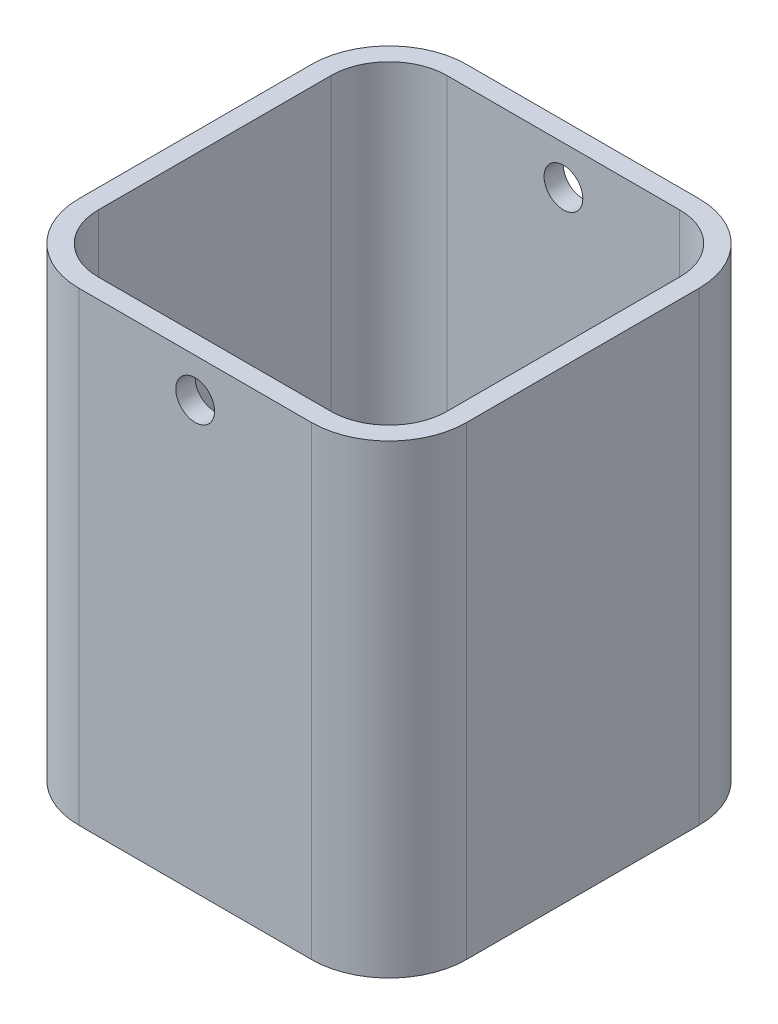
ISO-10303-21;
HEADER;
FILE_DESCRIPTION(('STEP AP214'),'2;1');
FILE_NAME('part.step','',(''),(''),'','','');
FILE_SCHEMA(('AUTOMOTIVE_DESIGN { 1 0 10303 214 1 1 1 1 }'));
ENDSEC;
DATA;
#1=APPLICATION_CONTEXT('core data for automotive mechanical design processes');
#2=APPLICATION_PROTOCOL_DEFINITION('international standard','automotive_design',2000,#1);
#3=PRODUCT_CONTEXT('',#1,'mechanical');
#4=PRODUCT('Part','Part','',(#3));
#5=PRODUCT_RELATED_PRODUCT_CATEGORY('part','',(#4));
#6=PRODUCT_DEFINITION_FORMATION('','',#4);
#7=PRODUCT_DEFINITION_CONTEXT('part definition',#1,'design');
#8=PRODUCT_DEFINITION('design','',#6,#7);
#9=PRODUCT_DEFINITION_SHAPE('','',#8);
#10=(LENGTH_UNIT() NAMED_UNIT(*) SI_UNIT(.MILLI.,.METRE.));
#11=(NAMED_UNIT(*) PLANE_ANGLE_UNIT() SI_UNIT($,.RADIAN.));
#12=(NAMED_UNIT(*) SI_UNIT($,.STERADIAN.) SOLID_ANGLE_UNIT());
#13=UNCERTAINTY_MEASURE_WITH_UNIT(LENGTH_MEASURE(1.E-05),#10,'distance_accuracy_value','');
#14=(GEOMETRIC_REPRESENTATION_CONTEXT(3) GLOBAL_UNCERTAINTY_ASSIGNED_CONTEXT((#13)) GLOBAL_UNIT_ASSIGNED_CONTEXT((#10,
#11,#12)) REPRESENTATION_CONTEXT('',''));
#15=CARTESIAN_POINT('',(0.,0.,0.));
#16=DIRECTION('',(0.,0.,1.));
#17=DIRECTION('',(1.,0.,0.));
#18=AXIS2_PLACEMENT_3D('',#15,#16,#17);
#19=CARTESIAN_POINT('',(0.,60.,0.));
#20=DIRECTION('',(1.,0.,0.));
#21=DIRECTION('',(0.,0.,-1.));
#22=AXIS2_PLACEMENT_3D('',#19,#20,#21);
#23=PLANE('',#22);
#24=DIRECTION('',(0.,0.,1.));
#25=VECTOR('',#24,1.);
#26=CARTESIAN_POINT('',(0.,60.,0.));
#27=LINE('',#26,#25);
#28=CARTESIAN_POINT('',(0.,60.,-40.));
#29=VERTEX_POINT('',#28);
#30=CARTESIAN_POINT('',(0.,60.,-10.));
#31=VERTEX_POINT('',#30);
#32=EDGE_CURVE('E223',#29,#31,#27,.T.);
#33=ORIENTED_EDGE('',*,*,#32,.F.);
#34=DIRECTION('',(0.,-1.,0.));
#35=VECTOR('',#34,1.);
#36=CARTESIAN_POINT('',(0.,60.,-40.));
#37=LINE('',#36,#35);
#38=CARTESIAN_POINT('',(0.,0.,-40.));
#39=VERTEX_POINT('',#38);
#40=EDGE_CURVE('E257',#29,#39,#37,.T.);
#41=ORIENTED_EDGE('',*,*,#40,.T.);
#42=DIRECTION('',(0.,0.,1.));
#43=VECTOR('',#42,1.);
#44=CARTESIAN_POINT('',(0.,0.,0.));
#45=LINE('',#44,#43);
#46=CARTESIAN_POINT('',(0.,0.,-10.));
#47=VERTEX_POINT('',#46);
#48=EDGE_CURVE('E240',#39,#47,#45,.T.);
#49=ORIENTED_EDGE('',*,*,#48,.T.);
#50=DIRECTION('',(0.,-1.,0.));
#51=VECTOR('',#50,1.);
#52=CARTESIAN_POINT('',(0.,60.,-10.));
#53=LINE('',#52,#51);
#54=EDGE_CURVE('E239',#47,#31,#53,.F.);
#55=ORIENTED_EDGE('',*,*,#54,.T.);
#56=EDGE_LOOP('',(#33,#41,#49,#55));
#57=FACE_BOUND('',#56,.T.);
#58=ADVANCED_FACE('F45',(#57),#23,.F.);
#59=CARTESIAN_POINT('',(0.,60.,0.));
#60=DIRECTION('',(0.,0.,-1.));
#61=DIRECTION('',(-1.,0.,0.));
#62=AXIS2_PLACEMENT_3D('',#59,#60,#61);
#63=PLANE('',#62);
#64=CARTESIAN_POINT('',(25.,55.,0.));
#65=DIRECTION('',(0.,0.,1.));
#66=DIRECTION('',(1.,0.,0.));
#67=AXIS2_PLACEMENT_3D('',#64,#65,#66);
#68=CIRCLE('',#67,2.5);
#69=CARTESIAN_POINT('',(27.5,55.,0.));
#70=VERTEX_POINT('',#69);
#71=EDGE_CURVE('E526',#70,#70,#68,.T.);
#72=ORIENTED_EDGE('',*,*,#71,.F.);
#73=EDGE_LOOP('',(#72));
#74=FACE_BOUND('',#73,.T.);
#75=DIRECTION('',(1.,0.,0.));
#76=VECTOR('',#75,1.);
#77=CARTESIAN_POINT('',(0.,0.,0.));
#78=LINE('',#77,#76);
#79=CARTESIAN_POINT('',(10.,0.,0.));
#80=VERTEX_POINT('',#79);
#81=CARTESIAN_POINT('',(40.,0.,0.));
#82=VERTEX_POINT('',#81);
#83=EDGE_CURVE('E244',#80,#82,#78,.T.);
#84=ORIENTED_EDGE('',*,*,#83,.T.);
#85=DIRECTION('',(0.,-1.,0.));
#86=VECTOR('',#85,1.);
#87=CARTESIAN_POINT('',(40.,60.,0.));
#88=LINE('',#87,#86);
#89=CARTESIAN_POINT('',(40.,60.,0.));
#90=VERTEX_POINT('',#89);
#91=EDGE_CURVE('E11',#82,#90,#88,.F.);
#92=ORIENTED_EDGE('',*,*,#91,.T.);
#93=DIRECTION('',(1.,0.,0.));
#94=VECTOR('',#93,1.);
#95=CARTESIAN_POINT('',(0.,60.,0.));
#96=LINE('',#95,#94);
#97=CARTESIAN_POINT('',(10.,60.,0.));
#98=VERTEX_POINT('',#97);
#99=EDGE_CURVE('E227',#98,#90,#96,.T.);
#100=ORIENTED_EDGE('',*,*,#99,.F.);
#101=DIRECTION('',(0.,-1.,0.));
#102=VECTOR('',#101,1.);
#103=CARTESIAN_POINT('',(10.,60.,0.));
#104=LINE('',#103,#102);
#105=EDGE_CURVE('E55',#98,#80,#104,.T.);
#106=ORIENTED_EDGE('',*,*,#105,.T.);
#107=EDGE_LOOP('',(#84,#92,#100,#106));
#108=FACE_BOUND('',#107,.T.);
#109=ADVANCED_FACE('F304',(#74,#108),#63,.F.);
#110=CARTESIAN_POINT('',(50.,60.,0.));
#111=DIRECTION('',(-1.,0.,0.));
#112=DIRECTION('',(0.,0.,1.));
#113=AXIS2_PLACEMENT_3D('',#110,#111,#112);
#114=PLANE('',#113);
#115=DIRECTION('',(0.,0.,-1.));
#116=VECTOR('',#115,1.);
#117=CARTESIAN_POINT('',(50.,0.,0.));
#118=LINE('',#117,#116);
#119=CARTESIAN_POINT('',(50.,0.,-10.));
#120=VERTEX_POINT('',#119);
#121=CARTESIAN_POINT('',(50.,0.,-40.));
#122=VERTEX_POINT('',#121);
#123=EDGE_CURVE('E249',#120,#122,#118,.T.);
#124=ORIENTED_EDGE('',*,*,#123,.T.);
#125=DIRECTION('',(0.,-1.,0.));
#126=VECTOR('',#125,1.);
#127=CARTESIAN_POINT('',(50.,60.,-40.));
#128=LINE('',#127,#126);
#129=CARTESIAN_POINT('',(50.,60.,-40.));
#130=VERTEX_POINT('',#129);
#131=EDGE_CURVE('E70',#122,#130,#128,.F.);
#132=ORIENTED_EDGE('',*,*,#131,.T.);
#133=DIRECTION('',(0.,0.,-1.));
#134=VECTOR('',#133,1.);
#135=CARTESIAN_POINT('',(50.,60.,0.));
#136=LINE('',#135,#134);
#137=CARTESIAN_POINT('',(50.,60.,-10.));
#138=VERTEX_POINT('',#137);
#139=EDGE_CURVE('E232',#138,#130,#136,.T.);
#140=ORIENTED_EDGE('',*,*,#139,.F.);
#141=DIRECTION('',(0.,-1.,0.));
#142=VECTOR('',#141,1.);
#143=CARTESIAN_POINT('',(50.,60.,-10.));
#144=LINE('',#143,#142);
#145=EDGE_CURVE('E292',#138,#120,#144,.T.);
#146=ORIENTED_EDGE('',*,*,#145,.T.);
#147=EDGE_LOOP('',(#124,#132,#140,#146));
#148=FACE_BOUND('',#147,.T.);
#149=ADVANCED_FACE('F316',(#148),#114,.F.);
#150=CARTESIAN_POINT('',(0.,60.,-50.));
#151=DIRECTION('',(0.,0.,1.));
#152=DIRECTION('',(1.,0.,0.));
#153=AXIS2_PLACEMENT_3D('',#150,#151,#152);
#154=PLANE('',#153);
#155=CARTESIAN_POINT('',(25.,55.,-50.));
#156=DIRECTION('',(0.,0.,1.));
#157=DIRECTION('',(1.,0.,0.));
#158=AXIS2_PLACEMENT_3D('',#155,#156,#157);
#159=CIRCLE('',#158,2.5);
#160=CARTESIAN_POINT('',(27.5,55.,-50.));
#161=VERTEX_POINT('',#160);
#162=EDGE_CURVE('E523',#161,#161,#159,.T.);
#163=ORIENTED_EDGE('',*,*,#162,.T.);
#164=EDGE_LOOP('',(#163));
#165=FACE_BOUND('',#164,.T.);
#166=DIRECTION('',(-1.,0.,0.));
#167=VECTOR('',#166,1.);
#168=CARTESIAN_POINT('',(0.,0.,-50.));
#169=LINE('',#168,#167);
#170=CARTESIAN_POINT('',(40.,0.,-50.));
#171=VERTEX_POINT('',#170);
#172=CARTESIAN_POINT('',(10.,0.,-50.));
#173=VERTEX_POINT('',#172);
#174=EDGE_CURVE('E228',#171,#173,#169,.T.);
#175=ORIENTED_EDGE('',*,*,#174,.T.);
#176=DIRECTION('',(0.,-1.,0.));
#177=VECTOR('',#176,1.);
#178=CARTESIAN_POINT('',(10.,60.,-50.));
#179=LINE('',#178,#177);
#180=CARTESIAN_POINT('',(10.,60.,-50.));
#181=VERTEX_POINT('',#180);
#182=EDGE_CURVE('E277',#173,#181,#179,.F.);
#183=ORIENTED_EDGE('',*,*,#182,.T.);
#184=DIRECTION('',(-1.,0.,0.));
#185=VECTOR('',#184,1.);
#186=CARTESIAN_POINT('',(0.,60.,-50.));
#187=LINE('',#186,#185);
#188=CARTESIAN_POINT('',(40.,60.,-50.));
#189=VERTEX_POINT('',#188);
#190=EDGE_CURVE('E235',#189,#181,#187,.T.);
#191=ORIENTED_EDGE('',*,*,#190,.F.);
#192=DIRECTION('',(0.,-1.,0.));
#193=VECTOR('',#192,1.);
#194=CARTESIAN_POINT('',(40.,60.,-50.));
#195=LINE('',#194,#193);
#196=EDGE_CURVE('E273',#189,#171,#195,.T.);
#197=ORIENTED_EDGE('',*,*,#196,.T.);
#198=EDGE_LOOP('',(#175,#183,#191,#197));
#199=FACE_BOUND('',#198,.T.);
#200=ADVANCED_FACE('F326',(#165,#199),#154,.F.);
#201=CARTESIAN_POINT('',(0.,60.,0.));
#202=DIRECTION('',(0.,-1.,0.));
#203=DIRECTION('',(0.,0.,-1.));
#204=AXIS2_PLACEMENT_3D('',#201,#202,#203);
#205=PLANE('',#204);
#206=DIRECTION('',(-1.,0.,0.));
#207=VECTOR('',#206,1.);
#208=CARTESIAN_POINT('',(0.,60.,-47.5));
#209=LINE('',#208,#207);
#210=CARTESIAN_POINT('',(40.,60.,-47.5));
#211=VERTEX_POINT('',#210);
#212=CARTESIAN_POINT('',(10.,60.,-47.5));
#213=VERTEX_POINT('',#212);
#214=EDGE_CURVE('E190',#211,#213,#209,.T.);
#215=ORIENTED_EDGE('',*,*,#214,.F.);
#216=CARTESIAN_POINT('',(40.,60.,-40.));
#217=DIRECTION('',(0.,-1.,0.));
#218=DIRECTION('',(0.,0.,-1.));
#219=AXIS2_PLACEMENT_3D('',#216,#217,#218);
#220=CIRCLE('',#219,7.5);
#221=CARTESIAN_POINT('',(47.5,60.,-40.));
#222=VERTEX_POINT('',#221);
#223=EDGE_CURVE('E211',#222,#211,#220,.F.);
#224=ORIENTED_EDGE('',*,*,#223,.F.);
#225=DIRECTION('',(0.,0.,-1.));
#226=VECTOR('',#225,1.);
#227=CARTESIAN_POINT('',(47.5,60.,0.));
#228=LINE('',#227,#226);
#229=CARTESIAN_POINT('',(47.5,60.,-10.));
#230=VERTEX_POINT('',#229);
#231=EDGE_CURVE('E62',#230,#222,#228,.T.);
#232=ORIENTED_EDGE('',*,*,#231,.F.);
#233=CARTESIAN_POINT('',(40.,60.,-10.));
#234=DIRECTION('',(0.,-1.,0.));
#235=DIRECTION('',(0.,0.,-1.));
#236=AXIS2_PLACEMENT_3D('',#233,#234,#235);
#237=CIRCLE('',#236,7.5);
#238=CARTESIAN_POINT('',(40.,60.,-2.5));
#239=VERTEX_POINT('',#238);
#240=EDGE_CURVE('E197',#239,#230,#237,.F.);
#241=ORIENTED_EDGE('',*,*,#240,.F.);
#242=DIRECTION('',(1.,0.,0.));
#243=VECTOR('',#242,1.);
#244=CARTESIAN_POINT('',(0.,60.,-2.5));
#245=LINE('',#244,#243);
#246=CARTESIAN_POINT('',(10.,60.,-2.5));
#247=VERTEX_POINT('',#246);
#248=EDGE_CURVE('E204',#247,#239,#245,.T.);
#249=ORIENTED_EDGE('',*,*,#248,.F.);
#250=CARTESIAN_POINT('',(10.,60.,-10.));
#251=DIRECTION('',(0.,-1.,0.));
#252=DIRECTION('',(0.,0.,-1.));
#253=AXIS2_PLACEMENT_3D('',#250,#251,#252);
#254=CIRCLE('',#253,7.5);
#255=CARTESIAN_POINT('',(2.5,60.,-10.));
#256=VERTEX_POINT('',#255);
#257=EDGE_CURVE('E193',#256,#247,#254,.F.);
#258=ORIENTED_EDGE('',*,*,#257,.F.);
#259=DIRECTION('',(0.,0.,1.));
#260=VECTOR('',#259,1.);
#261=CARTESIAN_POINT('',(2.5,60.,0.));
#262=LINE('',#261,#260);
#263=CARTESIAN_POINT('',(2.5,60.,-40.));
#264=VERTEX_POINT('',#263);
#265=EDGE_CURVE('E185',#264,#256,#262,.T.);
#266=ORIENTED_EDGE('',*,*,#265,.F.);
#267=CARTESIAN_POINT('',(10.,60.,-40.));
#268=DIRECTION('',(0.,-1.,0.));
#269=DIRECTION('',(0.,0.,-1.));
#270=AXIS2_PLACEMENT_3D('',#267,#268,#269);
#271=CIRCLE('',#270,7.5);
#272=EDGE_CURVE('E216',#213,#264,#271,.F.);
#273=ORIENTED_EDGE('',*,*,#272,.F.);
#274=EDGE_LOOP('',(#215,#224,#232,#241,#249,#258,#266,#273));
#275=FACE_BOUND('',#274,.T.);
#276=ORIENTED_EDGE('',*,*,#190,.T.);
#277=CARTESIAN_POINT('',(10.,60.,-40.));
#278=DIRECTION('',(0.,-1.,0.));
#279=DIRECTION('',(0.,0.,-1.));
#280=AXIS2_PLACEMENT_3D('',#277,#278,#279);
#281=CIRCLE('',#280,10.);
#282=EDGE_CURVE('E289',#181,#29,#281,.F.);
#283=ORIENTED_EDGE('',*,*,#282,.T.);
#284=ORIENTED_EDGE('',*,*,#32,.T.);
#285=CARTESIAN_POINT('',(10.,60.,-10.));
#286=DIRECTION('',(0.,-1.,0.));
#287=DIRECTION('',(0.,0.,-1.));
#288=AXIS2_PLACEMENT_3D('',#285,#286,#287);
#289=CIRCLE('',#288,10.);
#290=EDGE_CURVE('E280',#31,#98,#289,.F.);
#291=ORIENTED_EDGE('',*,*,#290,.T.);
#292=ORIENTED_EDGE('',*,*,#99,.T.);
#293=CARTESIAN_POINT('',(40.,60.,-10.));
#294=DIRECTION('',(0.,-1.,0.));
#295=DIRECTION('',(0.,0.,-1.));
#296=AXIS2_PLACEMENT_3D('',#293,#294,#295);
#297=CIRCLE('',#296,10.);
#298=EDGE_CURVE('E283',#90,#138,#297,.F.);
#299=ORIENTED_EDGE('',*,*,#298,.T.);
#300=ORIENTED_EDGE('',*,*,#139,.T.);
#301=CARTESIAN_POINT('',(40.,60.,-40.));
#302=DIRECTION('',(0.,-1.,0.));
#303=DIRECTION('',(0.,0.,-1.));
#304=AXIS2_PLACEMENT_3D('',#301,#302,#303);
#305=CIRCLE('',#304,10.);
#306=EDGE_CURVE('E286',#130,#189,#305,.F.);
#307=ORIENTED_EDGE('',*,*,#306,.T.);
#308=EDGE_LOOP('',(#276,#283,#284,#291,#292,#299,#300,#307));
#309=FACE_BOUND('',#308,.T.);
#310=ADVANCED_FACE('F319',(#275,#309),#205,.F.);
#311=CARTESIAN_POINT('',(0.,0.,0.));
#312=DIRECTION('',(0.,-1.,0.));
#313=DIRECTION('',(0.,0.,-1.));
#314=AXIS2_PLACEMENT_3D('',#311,#312,#313);
#315=PLANE('',#314);
#316=ORIENTED_EDGE('',*,*,#48,.F.);
#317=CARTESIAN_POINT('',(10.,0.,-40.));
#318=DIRECTION('',(0.,-1.,0.));
#319=DIRECTION('',(0.,0.,-1.));
#320=AXIS2_PLACEMENT_3D('',#317,#318,#319);
#321=CIRCLE('',#320,10.);
#322=EDGE_CURVE('E270',#39,#173,#321,.T.);
#323=ORIENTED_EDGE('',*,*,#322,.T.);
#324=ORIENTED_EDGE('',*,*,#174,.F.);
#325=CARTESIAN_POINT('',(40.,0.,-40.));
#326=DIRECTION('',(0.,-1.,0.));
#327=DIRECTION('',(0.,0.,-1.));
#328=AXIS2_PLACEMENT_3D('',#325,#326,#327);
#329=CIRCLE('',#328,10.);
#330=EDGE_CURVE('E267',#171,#122,#329,.T.);
#331=ORIENTED_EDGE('',*,*,#330,.T.);
#332=ORIENTED_EDGE('',*,*,#123,.F.);
#333=CARTESIAN_POINT('',(40.,0.,-10.));
#334=DIRECTION('',(0.,-1.,0.));
#335=DIRECTION('',(0.,0.,-1.));
#336=AXIS2_PLACEMENT_3D('',#333,#334,#335);
#337=CIRCLE('',#336,10.);
#338=EDGE_CURVE('E264',#120,#82,#337,.T.);
#339=ORIENTED_EDGE('',*,*,#338,.T.);
#340=ORIENTED_EDGE('',*,*,#83,.F.);
#341=CARTESIAN_POINT('',(10.,0.,-10.));
#342=DIRECTION('',(0.,-1.,0.));
#343=DIRECTION('',(0.,0.,-1.));
#344=AXIS2_PLACEMENT_3D('',#341,#342,#343);
#345=CIRCLE('',#344,10.);
#346=EDGE_CURVE('E261',#80,#47,#345,.T.);
#347=ORIENTED_EDGE('',*,*,#346,.T.);
#348=EDGE_LOOP('',(#316,#323,#324,#331,#332,#339,#340,#347));
#349=FACE_BOUND('',#348,.T.);
#350=ADVANCED_FACE('F310',(#349),#315,.T.);
#351=CARTESIAN_POINT('',(10.,60.,-40.));
#352=DIRECTION('',(0.,-1.,0.));
#353=DIRECTION('',(0.,0.,-1.));
#354=AXIS2_PLACEMENT_3D('',#351,#352,#353);
#355=CYLINDRICAL_SURFACE('',#354,10.);
#356=ORIENTED_EDGE('',*,*,#282,.F.);
#357=ORIENTED_EDGE('',*,*,#182,.F.);
#358=ORIENTED_EDGE('',*,*,#322,.F.);
#359=ORIENTED_EDGE('',*,*,#40,.F.);
#360=EDGE_LOOP('',(#356,#357,#358,#359));
#361=FACE_BOUND('',#360,.T.);
#362=ADVANCED_FACE('F331',(#361),#355,.T.);
#363=CARTESIAN_POINT('',(40.,60.,-40.));
#364=DIRECTION('',(0.,-1.,0.));
#365=DIRECTION('',(0.,0.,-1.));
#366=AXIS2_PLACEMENT_3D('',#363,#364,#365);
#367=CYLINDRICAL_SURFACE('',#366,10.);
#368=ORIENTED_EDGE('',*,*,#306,.F.);
#369=ORIENTED_EDGE('',*,*,#131,.F.);
#370=ORIENTED_EDGE('',*,*,#330,.F.);
#371=ORIENTED_EDGE('',*,*,#196,.F.);
#372=EDGE_LOOP('',(#368,#369,#370,#371));
#373=FACE_BOUND('',#372,.T.);
#374=ADVANCED_FACE('F323',(#373),#367,.T.);
#375=CARTESIAN_POINT('',(40.,60.,-10.));
#376=DIRECTION('',(0.,-1.,0.));
#377=DIRECTION('',(0.,0.,-1.));
#378=AXIS2_PLACEMENT_3D('',#375,#376,#377);
#379=CYLINDRICAL_SURFACE('',#378,10.);
#380=ORIENTED_EDGE('',*,*,#298,.F.);
#381=ORIENTED_EDGE('',*,*,#91,.F.);
#382=ORIENTED_EDGE('',*,*,#338,.F.);
#383=ORIENTED_EDGE('',*,*,#145,.F.);
#384=EDGE_LOOP('',(#380,#381,#382,#383));
#385=FACE_BOUND('',#384,.T.);
#386=ADVANCED_FACE('F315',(#385),#379,.T.);
#387=CARTESIAN_POINT('',(10.,60.,-10.));
#388=DIRECTION('',(0.,-1.,0.));
#389=DIRECTION('',(0.,0.,-1.));
#390=AXIS2_PLACEMENT_3D('',#387,#388,#389);
#391=CYLINDRICAL_SURFACE('',#390,10.);
#392=ORIENTED_EDGE('',*,*,#290,.F.);
#393=ORIENTED_EDGE('',*,*,#54,.F.);
#394=ORIENTED_EDGE('',*,*,#346,.F.);
#395=ORIENTED_EDGE('',*,*,#105,.F.);
#396=EDGE_LOOP('',(#392,#393,#394,#395));
#397=FACE_BOUND('',#396,.T.);
#398=ADVANCED_FACE('F47',(#397),#391,.T.);
#399=CARTESIAN_POINT('',(2.5,60.,0.));
#400=DIRECTION('',(1.,0.,0.));
#401=DIRECTION('',(0.,0.,-1.));
#402=AXIS2_PLACEMENT_3D('',#399,#400,#401);
#403=PLANE('',#402);
#404=ORIENTED_EDGE('',*,*,#265,.T.);
#405=DIRECTION('',(0.,1.,0.));
#406=VECTOR('',#405,1.);
#407=CARTESIAN_POINT('',(2.5,60.,-10.));
#408=LINE('',#407,#406);
#409=CARTESIAN_POINT('',(2.5,2.5,-10.));
#410=VERTEX_POINT('',#409);
#411=EDGE_CURVE('E219',#410,#256,#408,.T.);
#412=ORIENTED_EDGE('',*,*,#411,.F.);
#413=DIRECTION('',(0.,0.,1.));
#414=VECTOR('',#413,1.);
#415=CARTESIAN_POINT('',(2.5,2.5,0.));
#416=LINE('',#415,#414);
#417=CARTESIAN_POINT('',(2.5,2.5,-40.));
#418=VERTEX_POINT('',#417);
#419=EDGE_CURVE('E537',#418,#410,#416,.T.);
#420=ORIENTED_EDGE('',*,*,#419,.F.);
#421=DIRECTION('',(0.,1.,0.));
#422=VECTOR('',#421,1.);
#423=CARTESIAN_POINT('',(2.5,60.,-40.));
#424=LINE('',#423,#422);
#425=EDGE_CURVE('E169',#264,#418,#424,.F.);
#426=ORIENTED_EDGE('',*,*,#425,.F.);
#427=EDGE_LOOP('',(#404,#412,#420,#426));
#428=FACE_BOUND('',#427,.T.);
#429=ADVANCED_FACE('F336',(#428),#403,.T.);
#430=CARTESIAN_POINT('',(0.,60.,-2.5));
#431=DIRECTION('',(0.,0.,-1.));
#432=DIRECTION('',(-1.,0.,0.));
#433=AXIS2_PLACEMENT_3D('',#430,#431,#432);
#434=PLANE('',#433);
#435=CARTESIAN_POINT('',(25.,55.,-2.5));
#436=DIRECTION('',(0.,0.,-1.));
#437=DIRECTION('',(-1.,0.,0.));
#438=AXIS2_PLACEMENT_3D('',#435,#436,#437);
#439=CIRCLE('',#438,2.5);
#440=CARTESIAN_POINT('',(22.5,55.,-2.5));
#441=VERTEX_POINT('',#440);
#442=EDGE_CURVE('E531',#441,#441,#439,.T.);
#443=ORIENTED_EDGE('',*,*,#442,.F.);
#444=EDGE_LOOP('',(#443));
#445=FACE_BOUND('',#444,.T.);
#446=DIRECTION('',(1.,0.,0.));
#447=VECTOR('',#446,1.);
#448=CARTESIAN_POINT('',(0.,2.5,-2.5));
#449=LINE('',#448,#447);
#450=CARTESIAN_POINT('',(10.,2.5,-2.5));
#451=VERTEX_POINT('',#450);
#452=CARTESIAN_POINT('',(40.,2.5,-2.5));
#453=VERTEX_POINT('',#452);
#454=EDGE_CURVE('E543',#451,#453,#449,.T.);
#455=ORIENTED_EDGE('',*,*,#454,.F.);
#456=DIRECTION('',(0.,1.,0.));
#457=VECTOR('',#456,1.);
#458=CARTESIAN_POINT('',(10.,60.,-2.5));
#459=LINE('',#458,#457);
#460=EDGE_CURVE('E560',#247,#451,#459,.F.);
#461=ORIENTED_EDGE('',*,*,#460,.F.);
#462=ORIENTED_EDGE('',*,*,#248,.T.);
#463=DIRECTION('',(0.,1.,0.));
#464=VECTOR('',#463,1.);
#465=CARTESIAN_POINT('',(40.,60.,-2.5));
#466=LINE('',#465,#464);
#467=EDGE_CURVE('E245',#453,#239,#466,.T.);
#468=ORIENTED_EDGE('',*,*,#467,.F.);
#469=EDGE_LOOP('',(#455,#461,#462,#468));
#470=FACE_BOUND('',#469,.T.);
#471=ADVANCED_FACE('F342',(#445,#470),#434,.T.);
#472=CARTESIAN_POINT('',(47.5,60.,0.));
#473=DIRECTION('',(-1.,0.,0.));
#474=DIRECTION('',(0.,0.,1.));
#475=AXIS2_PLACEMENT_3D('',#472,#473,#474);
#476=PLANE('',#475);
#477=DIRECTION('',(0.,0.,-1.));
#478=VECTOR('',#477,1.);
#479=CARTESIAN_POINT('',(47.5,2.5,0.));
#480=LINE('',#479,#478);
#481=CARTESIAN_POINT('',(47.5,2.5,-10.));
#482=VERTEX_POINT('',#481);
#483=CARTESIAN_POINT('',(47.5,2.5,-40.));
#484=VERTEX_POINT('',#483);
#485=EDGE_CURVE('E186',#482,#484,#480,.T.);
#486=ORIENTED_EDGE('',*,*,#485,.F.);
#487=DIRECTION('',(0.,1.,0.));
#488=VECTOR('',#487,1.);
#489=CARTESIAN_POINT('',(47.5,60.,-10.));
#490=LINE('',#489,#488);
#491=EDGE_CURVE('E222',#230,#482,#490,.F.);
#492=ORIENTED_EDGE('',*,*,#491,.F.);
#493=ORIENTED_EDGE('',*,*,#231,.T.);
#494=DIRECTION('',(0.,1.,0.));
#495=VECTOR('',#494,1.);
#496=CARTESIAN_POINT('',(47.5,60.,-40.));
#497=LINE('',#496,#495);
#498=EDGE_CURVE('E564',#484,#222,#497,.T.);
#499=ORIENTED_EDGE('',*,*,#498,.F.);
#500=EDGE_LOOP('',(#486,#492,#493,#499));
#501=FACE_BOUND('',#500,.T.);
#502=ADVANCED_FACE('F389',(#501),#476,.T.);
#503=CARTESIAN_POINT('',(0.,60.,-47.5));
#504=DIRECTION('',(0.,0.,1.));
#505=DIRECTION('',(1.,0.,0.));
#506=AXIS2_PLACEMENT_3D('',#503,#504,#505);
#507=PLANE('',#506);
#508=CARTESIAN_POINT('',(25.,55.,-47.5));
#509=DIRECTION('',(0.,0.,1.));
#510=DIRECTION('',(1.,0.,0.));
#511=AXIS2_PLACEMENT_3D('',#508,#509,#510);
#512=CIRCLE('',#511,2.5);
#513=CARTESIAN_POINT('',(27.5,55.,-47.5));
#514=VERTEX_POINT('',#513);
#515=EDGE_CURVE('E49',#514,#514,#512,.T.);
#516=ORIENTED_EDGE('',*,*,#515,.F.);
#517=EDGE_LOOP('',(#516));
#518=FACE_BOUND('',#517,.T.);
#519=DIRECTION('',(-1.,0.,0.));
#520=VECTOR('',#519,1.);
#521=CARTESIAN_POINT('',(0.,2.5,-47.5));
#522=LINE('',#521,#520);
#523=CARTESIAN_POINT('',(40.,2.5,-47.5));
#524=VERTEX_POINT('',#523);
#525=CARTESIAN_POINT('',(10.,2.5,-47.5));
#526=VERTEX_POINT('',#525);
#527=EDGE_CURVE('E178',#524,#526,#522,.T.);
#528=ORIENTED_EDGE('',*,*,#527,.F.);
#529=DIRECTION('',(0.,1.,0.));
#530=VECTOR('',#529,1.);
#531=CARTESIAN_POINT('',(40.,60.,-47.5));
#532=LINE('',#531,#530);
#533=EDGE_CURVE('E174',#211,#524,#532,.F.);
#534=ORIENTED_EDGE('',*,*,#533,.F.);
#535=ORIENTED_EDGE('',*,*,#214,.T.);
#536=DIRECTION('',(0.,1.,0.));
#537=VECTOR('',#536,1.);
#538=CARTESIAN_POINT('',(10.,60.,-47.5));
#539=LINE('',#538,#537);
#540=EDGE_CURVE('E166',#526,#213,#539,.T.);
#541=ORIENTED_EDGE('',*,*,#540,.F.);
#542=EDGE_LOOP('',(#528,#534,#535,#541));
#543=FACE_BOUND('',#542,.T.);
#544=ADVANCED_FACE('F188',(#518,#543),#507,.T.);
#545=CARTESIAN_POINT('',(0.,2.5,0.));
#546=DIRECTION('',(0.,-1.,0.));
#547=DIRECTION('',(0.,0.,-1.));
#548=AXIS2_PLACEMENT_3D('',#545,#546,#547);
#549=PLANE('',#548);
#550=ORIENTED_EDGE('',*,*,#419,.T.);
#551=CARTESIAN_POINT('',(10.,2.5,-10.));
#552=DIRECTION('',(0.,-1.,0.));
#553=DIRECTION('',(0.,0.,-1.));
#554=AXIS2_PLACEMENT_3D('',#551,#552,#553);
#555=CIRCLE('',#554,7.5);
#556=EDGE_CURVE('E540',#451,#410,#555,.T.);
#557=ORIENTED_EDGE('',*,*,#556,.F.);
#558=ORIENTED_EDGE('',*,*,#454,.T.);
#559=CARTESIAN_POINT('',(40.,2.5,-10.));
#560=DIRECTION('',(0.,-1.,0.));
#561=DIRECTION('',(0.,0.,-1.));
#562=AXIS2_PLACEMENT_3D('',#559,#560,#561);
#563=CIRCLE('',#562,7.5);
#564=EDGE_CURVE('E548',#482,#453,#563,.T.);
#565=ORIENTED_EDGE('',*,*,#564,.F.);
#566=ORIENTED_EDGE('',*,*,#485,.T.);
#567=CARTESIAN_POINT('',(40.,2.5,-40.));
#568=DIRECTION('',(0.,-1.,0.));
#569=DIRECTION('',(0.,0.,-1.));
#570=AXIS2_PLACEMENT_3D('',#567,#568,#569);
#571=CIRCLE('',#570,7.5);
#572=EDGE_CURVE('E175',#524,#484,#571,.T.);
#573=ORIENTED_EDGE('',*,*,#572,.F.);
#574=ORIENTED_EDGE('',*,*,#527,.T.);
#575=CARTESIAN_POINT('',(10.,2.5,-40.));
#576=DIRECTION('',(0.,-1.,0.));
#577=DIRECTION('',(0.,0.,-1.));
#578=AXIS2_PLACEMENT_3D('',#575,#576,#577);
#579=CIRCLE('',#578,7.5);
#580=EDGE_CURVE('E162',#418,#526,#579,.T.);
#581=ORIENTED_EDGE('',*,*,#580,.F.);
#582=EDGE_LOOP('',(#550,#557,#558,#565,#566,#573,#574,#581));
#583=FACE_BOUND('',#582,.T.);
#584=ADVANCED_FACE('F179',(#583),#549,.F.);
#585=CARTESIAN_POINT('',(10.,60.,-40.));
#586=DIRECTION('',(0.,-1.,0.));
#587=DIRECTION('',(0.,0.,-1.));
#588=AXIS2_PLACEMENT_3D('',#585,#586,#587);
#589=CYLINDRICAL_SURFACE('',#588,7.5);
#590=ORIENTED_EDGE('',*,*,#272,.T.);
#591=ORIENTED_EDGE('',*,*,#425,.T.);
#592=ORIENTED_EDGE('',*,*,#580,.T.);
#593=ORIENTED_EDGE('',*,*,#540,.T.);
#594=EDGE_LOOP('',(#590,#591,#592,#593));
#595=FACE_BOUND('',#594,.T.);
#596=ADVANCED_FACE('F164',(#595),#589,.F.);
#597=CARTESIAN_POINT('',(40.,60.,-40.));
#598=DIRECTION('',(0.,-1.,0.));
#599=DIRECTION('',(0.,0.,-1.));
#600=AXIS2_PLACEMENT_3D('',#597,#598,#599);
#601=CYLINDRICAL_SURFACE('',#600,7.5);
#602=ORIENTED_EDGE('',*,*,#223,.T.);
#603=ORIENTED_EDGE('',*,*,#533,.T.);
#604=ORIENTED_EDGE('',*,*,#572,.T.);
#605=ORIENTED_EDGE('',*,*,#498,.T.);
#606=EDGE_LOOP('',(#602,#603,#604,#605));
#607=FACE_BOUND('',#606,.T.);
#608=ADVANCED_FACE('F425',(#607),#601,.F.);
#609=CARTESIAN_POINT('',(40.,60.,-10.));
#610=DIRECTION('',(0.,-1.,0.));
#611=DIRECTION('',(0.,0.,-1.));
#612=AXIS2_PLACEMENT_3D('',#609,#610,#611);
#613=CYLINDRICAL_SURFACE('',#612,7.5);
#614=ORIENTED_EDGE('',*,*,#240,.T.);
#615=ORIENTED_EDGE('',*,*,#491,.T.);
#616=ORIENTED_EDGE('',*,*,#564,.T.);
#617=ORIENTED_EDGE('',*,*,#467,.T.);
#618=EDGE_LOOP('',(#614,#615,#616,#617));
#619=FACE_BOUND('',#618,.T.);
#620=ADVANCED_FACE('F434',(#619),#613,.F.);
#621=CARTESIAN_POINT('',(10.,60.,-10.));
#622=DIRECTION('',(0.,-1.,0.));
#623=DIRECTION('',(0.,0.,-1.));
#624=AXIS2_PLACEMENT_3D('',#621,#622,#623);
#625=CYLINDRICAL_SURFACE('',#624,7.5);
#626=ORIENTED_EDGE('',*,*,#257,.T.);
#627=ORIENTED_EDGE('',*,*,#460,.T.);
#628=ORIENTED_EDGE('',*,*,#556,.T.);
#629=ORIENTED_EDGE('',*,*,#411,.T.);
#630=EDGE_LOOP('',(#626,#627,#628,#629));
#631=FACE_BOUND('',#630,.T.);
#632=ADVANCED_FACE('F444',(#631),#625,.F.);
#633=CARTESIAN_POINT('',(25.,55.,-50.));
#634=DIRECTION('',(0.,0.,1.));
#635=DIRECTION('',(1.,0.,0.));
#636=AXIS2_PLACEMENT_3D('',#633,#634,#635);
#637=CYLINDRICAL_SURFACE('',#636,2.5);
#638=ORIENTED_EDGE('',*,*,#515,.T.);
#639=EDGE_LOOP('',(#638));
#640=FACE_BOUND('',#639,.T.);
#641=ORIENTED_EDGE('',*,*,#162,.F.);
#642=EDGE_LOOP('',(#641));
#643=FACE_BOUND('',#642,.T.);
#644=ADVANCED_FACE('F454',(#640,#643),#637,.F.);
#645=ORIENTED_EDGE('',*,*,#442,.T.);
#646=EDGE_LOOP('',(#645));
#647=FACE_BOUND('',#646,.T.);
#648=ORIENTED_EDGE('',*,*,#71,.T.);
#649=EDGE_LOOP('',(#648));
#650=FACE_BOUND('',#649,.T.);
#651=ADVANCED_FACE('F463',(#647,#650),#637,.F.);
#652=CLOSED_SHELL('',(#58,#109,#149,#200,#310,#350,#362,#374,#386,#398,#429,#471,#502,#544,#584,
#596,#608,#620,#632,#644,#651));
#653=MANIFOLD_SOLID_BREP('B2',#652);
#654=ADVANCED_BREP_SHAPE_REPRESENTATION('',(#18,#653),#14);
#655=SHAPE_DEFINITION_REPRESENTATION(#9,#654);
ENDSEC;
END-ISO-10303-21;
